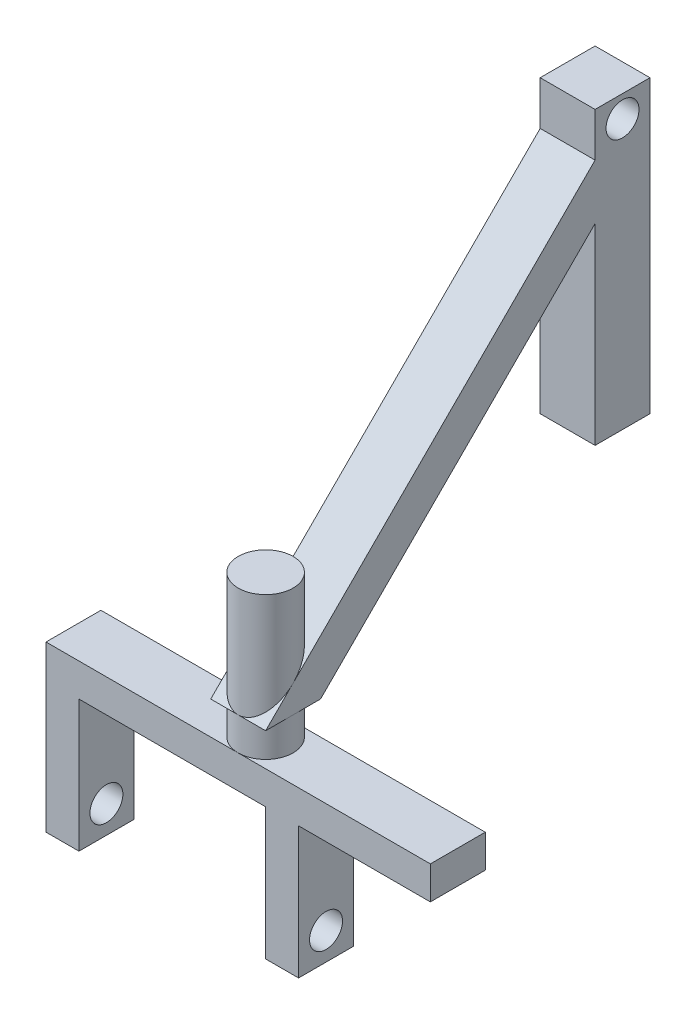
ISO-10303-21;
HEADER;
FILE_DESCRIPTION(('STEP AP214'),'2;1');
FILE_NAME('part.step','',(''),(''),'','','');
FILE_SCHEMA(('AUTOMOTIVE_DESIGN { 1 0 10303 214 1 1 1 1 }'));
ENDSEC;
DATA;
#1=APPLICATION_CONTEXT('core data for automotive mechanical design processes');
#2=APPLICATION_PROTOCOL_DEFINITION('international standard','automotive_design',2000,#1);
#3=PRODUCT_CONTEXT('',#1,'mechanical');
#4=PRODUCT('Part','Part','',(#3));
#5=PRODUCT_RELATED_PRODUCT_CATEGORY('part','',(#4));
#6=PRODUCT_DEFINITION_FORMATION('','',#4);
#7=PRODUCT_DEFINITION_CONTEXT('part definition',#1,'design');
#8=PRODUCT_DEFINITION('design','',#6,#7);
#9=PRODUCT_DEFINITION_SHAPE('','',#8);
#10=(LENGTH_UNIT() NAMED_UNIT(*) SI_UNIT(.MILLI.,.METRE.));
#11=(NAMED_UNIT(*) PLANE_ANGLE_UNIT() SI_UNIT($,.RADIAN.));
#12=(NAMED_UNIT(*) SI_UNIT($,.STERADIAN.) SOLID_ANGLE_UNIT());
#13=UNCERTAINTY_MEASURE_WITH_UNIT(LENGTH_MEASURE(1.E-05),#10,'distance_accuracy_value','');
#14=(GEOMETRIC_REPRESENTATION_CONTEXT(3) GLOBAL_UNCERTAINTY_ASSIGNED_CONTEXT((#13)) GLOBAL_UNIT_ASSIGNED_CONTEXT((#10,
#11,#12)) REPRESENTATION_CONTEXT('',''));
#15=CARTESIAN_POINT('',(0.,0.,0.));
#16=DIRECTION('',(0.,0.,1.));
#17=DIRECTION('',(1.,0.,0.));
#18=AXIS2_PLACEMENT_3D('',#15,#16,#17);
#19=CARTESIAN_POINT('',(0.,0.,50.));
#20=DIRECTION('',(1.,0.,0.));
#21=DIRECTION('',(0.,0.,-1.));
#22=AXIS2_PLACEMENT_3D('',#19,#20,#21);
#23=PLANE('',#22);
#24=CARTESIAN_POINT('',(0.,320.076220664814,25.));
#25=DIRECTION('',(1.,0.,0.));
#26=DIRECTION('',(0.,0.,-1.));
#27=AXIS2_PLACEMENT_3D('',#24,#25,#26);
#28=CIRCLE('',#27,15.);
#29=CARTESIAN_POINT('',(0.,320.076220664814,10.));
#30=VERTEX_POINT('',#29);
#31=EDGE_CURVE('E207',#30,#30,#28,.T.);
#32=ORIENTED_EDGE('',*,*,#31,.T.);
#33=EDGE_LOOP('',(#32));
#34=FACE_BOUND('',#33,.T.);
#35=DIRECTION('',(0.,0.707106781186548,-0.707106781186548));
#36=VECTOR('',#35,1.);
#37=CARTESIAN_POINT('',(0.,0.,350.));
#38=LINE('',#37,#36);
#39=CARTESIAN_POINT('',(0.,25.,325.));
#40=VERTEX_POINT('',#39);
#41=CARTESIAN_POINT('',(0.,300.,50.));
#42=VERTEX_POINT('',#41);
#43=EDGE_CURVE('E211',#40,#42,#38,.T.);
#44=ORIENTED_EDGE('',*,*,#43,.T.);
#45=DIRECTION('',(0.,-1.,0.));
#46=VECTOR('',#45,1.);
#47=CARTESIAN_POINT('',(0.,340.,50.));
#48=LINE('',#47,#46);
#49=CARTESIAN_POINT('',(0.,340.,50.));
#50=VERTEX_POINT('',#49);
#51=EDGE_CURVE('E192',#50,#42,#48,.T.);
#52=ORIENTED_EDGE('',*,*,#51,.F.);
#53=DIRECTION('',(0.,0.,1.));
#54=VECTOR('',#53,1.);
#55=CARTESIAN_POINT('',(0.,340.,0.));
#56=LINE('',#55,#54);
#57=CARTESIAN_POINT('',(0.,340.,0.));
#58=VERTEX_POINT('',#57);
#59=EDGE_CURVE('E199',#58,#50,#56,.T.);
#60=ORIENTED_EDGE('',*,*,#59,.F.);
#61=DIRECTION('',(0.,-1.,0.));
#62=VECTOR('',#61,1.);
#63=CARTESIAN_POINT('',(0.,0.,0.));
#64=LINE('',#63,#62);
#65=CARTESIAN_POINT('',(0.,75.,0.));
#66=VERTEX_POINT('',#65);
#67=EDGE_CURVE('E349',#58,#66,#64,.T.);
#68=ORIENTED_EDGE('',*,*,#67,.T.);
#69=DIRECTION('',(0.,0.,1.));
#70=VECTOR('',#69,1.);
#71=CARTESIAN_POINT('',(0.,75.,0.));
#72=LINE('',#71,#70);
#73=CARTESIAN_POINT('',(0.,75.,50.));
#74=VERTEX_POINT('',#73);
#75=EDGE_CURVE('E340',#66,#74,#72,.T.);
#76=ORIENTED_EDGE('',*,*,#75,.T.);
#77=DIRECTION('',(0.,-1.,0.));
#78=VECTOR('',#77,1.);
#79=CARTESIAN_POINT('',(0.,0.,50.));
#80=LINE('',#79,#78);
#81=CARTESIAN_POINT('',(0.,250.,50.));
#82=VERTEX_POINT('',#81);
#83=EDGE_CURVE('E352',#82,#74,#80,.T.);
#84=ORIENTED_EDGE('',*,*,#83,.F.);
#85=DIRECTION('',(0.,-0.707106781186548,0.707106781186548));
#86=VECTOR('',#85,1.);
#87=CARTESIAN_POINT('',(0.,0.,300.));
#88=LINE('',#87,#86);
#89=CARTESIAN_POINT('',(0.,0.,300.));
#90=VERTEX_POINT('',#89);
#91=EDGE_CURVE('E321',#82,#90,#88,.T.);
#92=ORIENTED_EDGE('',*,*,#91,.T.);
#93=DIRECTION('',(0.,0.,1.));
#94=VECTOR('',#93,1.);
#95=CARTESIAN_POINT('',(0.,0.,350.));
#96=LINE('',#95,#94);
#97=CARTESIAN_POINT('',(0.,0.,325.));
#98=VERTEX_POINT('',#97);
#99=EDGE_CURVE('E325',#90,#98,#96,.T.);
#100=ORIENTED_EDGE('',*,*,#99,.T.);
#101=CARTESIAN_POINT('',(0.,0.,350.));
#102=VERTEX_POINT('',#101);
#103=EDGE_CURVE('E324',#98,#102,#96,.T.);
#104=ORIENTED_EDGE('',*,*,#103,.T.);
#105=EDGE_CURVE('E312',#102,#40,#38,.T.);
#106=ORIENTED_EDGE('',*,*,#105,.T.);
#107=EDGE_LOOP('',(#44,#52,#60,#68,#76,#84,#92,#100,#104,#106));
#108=FACE_BOUND('',#107,.T.);
#109=ADVANCED_FACE('F38',(#34,#108),#23,.F.);
#110=CARTESIAN_POINT('',(50.,0.,50.));
#111=DIRECTION('',(-1.,0.,0.));
#112=DIRECTION('',(0.,0.,1.));
#113=AXIS2_PLACEMENT_3D('',#110,#111,#112);
#114=PLANE('',#113);
#115=CARTESIAN_POINT('',(50.,320.076220664814,25.));
#116=DIRECTION('',(1.,0.,0.));
#117=DIRECTION('',(0.,0.,-1.));
#118=AXIS2_PLACEMENT_3D('',#115,#116,#117);
#119=CIRCLE('',#118,15.);
#120=CARTESIAN_POINT('',(50.,320.076220664814,10.));
#121=VERTEX_POINT('',#120);
#122=EDGE_CURVE('E426',#121,#121,#119,.T.);
#123=ORIENTED_EDGE('',*,*,#122,.F.);
#124=EDGE_LOOP('',(#123));
#125=FACE_BOUND('',#124,.T.);
#126=DIRECTION('',(0.,1.,0.));
#127=VECTOR('',#126,1.);
#128=CARTESIAN_POINT('',(50.,0.,0.));
#129=LINE('',#128,#127);
#130=CARTESIAN_POINT('',(50.,75.,0.));
#131=VERTEX_POINT('',#130);
#132=CARTESIAN_POINT('',(50.,340.,0.));
#133=VERTEX_POINT('',#132);
#134=EDGE_CURVE('E355',#131,#133,#129,.T.);
#135=ORIENTED_EDGE('',*,*,#134,.T.);
#136=DIRECTION('',(0.,0.,-1.));
#137=VECTOR('',#136,1.);
#138=CARTESIAN_POINT('',(50.,340.,0.));
#139=LINE('',#138,#137);
#140=CARTESIAN_POINT('',(50.,340.,50.));
#141=VERTEX_POINT('',#140);
#142=EDGE_CURVE('E198',#141,#133,#139,.T.);
#143=ORIENTED_EDGE('',*,*,#142,.F.);
#144=DIRECTION('',(0.,-1.,0.));
#145=VECTOR('',#144,1.);
#146=CARTESIAN_POINT('',(50.,340.,50.));
#147=LINE('',#146,#145);
#148=CARTESIAN_POINT('',(50.,300.,50.));
#149=VERTEX_POINT('',#148);
#150=EDGE_CURVE('E194',#141,#149,#147,.T.);
#151=ORIENTED_EDGE('',*,*,#150,.T.);
#152=DIRECTION('',(0.,0.707106781186548,-0.707106781186548));
#153=VECTOR('',#152,1.);
#154=CARTESIAN_POINT('',(50.,0.,350.));
#155=LINE('',#154,#153);
#156=CARTESIAN_POINT('',(50.,25.,325.));
#157=VERTEX_POINT('',#156);
#158=EDGE_CURVE('E316',#157,#149,#155,.T.);
#159=ORIENTED_EDGE('',*,*,#158,.F.);
#160=CARTESIAN_POINT('',(50.,0.,350.));
#161=VERTEX_POINT('',#160);
#162=EDGE_CURVE('E317',#161,#157,#155,.T.);
#163=ORIENTED_EDGE('',*,*,#162,.F.);
#164=DIRECTION('',(0.,0.,1.));
#165=VECTOR('',#164,1.);
#166=CARTESIAN_POINT('',(50.,0.,350.));
#167=LINE('',#166,#165);
#168=CARTESIAN_POINT('',(50.,0.,325.));
#169=VERTEX_POINT('',#168);
#170=EDGE_CURVE('E311',#169,#161,#167,.T.);
#171=ORIENTED_EDGE('',*,*,#170,.F.);
#172=CARTESIAN_POINT('',(50.,0.,300.));
#173=VERTEX_POINT('',#172);
#174=EDGE_CURVE('E313',#173,#169,#167,.T.);
#175=ORIENTED_EDGE('',*,*,#174,.F.);
#176=DIRECTION('',(0.,-0.707106781186548,0.707106781186548));
#177=VECTOR('',#176,1.);
#178=CARTESIAN_POINT('',(50.,0.,300.));
#179=LINE('',#178,#177);
#180=CARTESIAN_POINT('',(50.,250.,50.));
#181=VERTEX_POINT('',#180);
#182=EDGE_CURVE('E309',#181,#173,#179,.T.);
#183=ORIENTED_EDGE('',*,*,#182,.F.);
#184=DIRECTION('',(0.,1.,0.));
#185=VECTOR('',#184,1.);
#186=CARTESIAN_POINT('',(50.,0.,50.));
#187=LINE('',#186,#185);
#188=CARTESIAN_POINT('',(50.,75.,50.));
#189=VERTEX_POINT('',#188);
#190=EDGE_CURVE('E354',#189,#181,#187,.T.);
#191=ORIENTED_EDGE('',*,*,#190,.F.);
#192=DIRECTION('',(0.,0.,1.));
#193=VECTOR('',#192,1.);
#194=CARTESIAN_POINT('',(50.,75.,0.));
#195=LINE('',#194,#193);
#196=EDGE_CURVE('E341',#131,#189,#195,.T.);
#197=ORIENTED_EDGE('',*,*,#196,.F.);
#198=EDGE_LOOP('',(#135,#143,#151,#159,#163,#171,#175,#183,#191,#197));
#199=FACE_BOUND('',#198,.T.);
#200=ADVANCED_FACE('F392',(#125,#199),#114,.F.);
#201=CARTESIAN_POINT('',(0.,0.,0.));
#202=DIRECTION('',(0.,0.,-1.));
#203=DIRECTION('',(-1.,0.,0.));
#204=AXIS2_PLACEMENT_3D('',#201,#202,#203);
#205=PLANE('',#204);
#206=ORIENTED_EDGE('',*,*,#67,.F.);
#207=DIRECTION('',(-1.,0.,0.));
#208=VECTOR('',#207,1.);
#209=CARTESIAN_POINT('',(0.,340.,0.));
#210=LINE('',#209,#208);
#211=EDGE_CURVE('E205',#133,#58,#210,.T.);
#212=ORIENTED_EDGE('',*,*,#211,.F.);
#213=ORIENTED_EDGE('',*,*,#134,.F.);
#214=DIRECTION('',(-1.,0.,0.));
#215=VECTOR('',#214,1.);
#216=CARTESIAN_POINT('',(50.,75.,0.));
#217=LINE('',#216,#215);
#218=EDGE_CURVE('E343',#131,#66,#217,.T.);
#219=ORIENTED_EDGE('',*,*,#218,.T.);
#220=EDGE_LOOP('',(#206,#212,#213,#219));
#221=FACE_BOUND('',#220,.T.);
#222=ADVANCED_FACE('F421',(#221),#205,.T.);
#223=CARTESIAN_POINT('',(0.,-60.,0.));
#224=DIRECTION('',(0.,-1.,0.));
#225=DIRECTION('',(0.,0.,-1.));
#226=AXIS2_PLACEMENT_3D('',#223,#224,#225);
#227=PLANE('',#226);
#228=DIRECTION('',(1.,0.,0.));
#229=VECTOR('',#228,1.);
#230=CARTESIAN_POINT('',(50.,-60.,300.));
#231=LINE('',#230,#229);
#232=CARTESIAN_POINT('',(-120.,-60.,300.));
#233=VERTEX_POINT('',#232);
#234=CARTESIAN_POINT('',(50.,-60.,300.));
#235=VERTEX_POINT('',#234);
#236=EDGE_CURVE('E281',#233,#235,#231,.T.);
#237=ORIENTED_EDGE('',*,*,#236,.T.);
#238=DIRECTION('',(0.,0.,-1.));
#239=VECTOR('',#238,1.);
#240=CARTESIAN_POINT('',(50.,-60.,300.));
#241=LINE('',#240,#239);
#242=CARTESIAN_POINT('',(50.,-60.,350.));
#243=VERTEX_POINT('',#242);
#244=EDGE_CURVE('E53',#243,#235,#241,.T.);
#245=ORIENTED_EDGE('',*,*,#244,.F.);
#246=DIRECTION('',(-1.,0.,0.));
#247=VECTOR('',#246,1.);
#248=CARTESIAN_POINT('',(50.,-60.,350.));
#249=LINE('',#248,#247);
#250=CARTESIAN_POINT('',(-120.,-60.,350.));
#251=VERTEX_POINT('',#250);
#252=EDGE_CURVE('E285',#243,#251,#249,.T.);
#253=ORIENTED_EDGE('',*,*,#252,.T.);
#254=DIRECTION('',(0.,0.,-1.));
#255=VECTOR('',#254,1.);
#256=CARTESIAN_POINT('',(-120.,-60.,0.));
#257=LINE('',#256,#255);
#258=EDGE_CURVE('E11',#251,#233,#257,.T.);
#259=ORIENTED_EDGE('',*,*,#258,.T.);
#260=EDGE_LOOP('',(#237,#245,#253,#259));
#261=FACE_BOUND('',#260,.T.);
#262=ADVANCED_FACE('F408',(#261),#227,.T.);
#263=CARTESIAN_POINT('',(200.,-60.,350.));
#264=VERTEX_POINT('',#263);
#265=CARTESIAN_POINT('',(80.,-60.,350.));
#266=VERTEX_POINT('',#265);
#267=EDGE_CURVE('E61',#264,#266,#249,.T.);
#268=ORIENTED_EDGE('',*,*,#267,.T.);
#269=DIRECTION('',(0.,0.,1.));
#270=VECTOR('',#269,1.);
#271=CARTESIAN_POINT('',(80.,-60.,300.));
#272=LINE('',#271,#270);
#273=CARTESIAN_POINT('',(80.,-60.,300.));
#274=VERTEX_POINT('',#273);
#275=EDGE_CURVE('E230',#274,#266,#272,.T.);
#276=ORIENTED_EDGE('',*,*,#275,.F.);
#277=CARTESIAN_POINT('',(200.,-60.,300.));
#278=VERTEX_POINT('',#277);
#279=EDGE_CURVE('E265',#274,#278,#231,.T.);
#280=ORIENTED_EDGE('',*,*,#279,.T.);
#281=DIRECTION('',(0.,0.,1.));
#282=VECTOR('',#281,1.);
#283=CARTESIAN_POINT('',(200.,-60.,350.));
#284=LINE('',#283,#282);
#285=EDGE_CURVE('E283',#278,#264,#284,.T.);
#286=ORIENTED_EDGE('',*,*,#285,.T.);
#287=EDGE_LOOP('',(#268,#276,#280,#286));
#288=FACE_BOUND('',#287,.T.);
#289=ADVANCED_FACE('F401',(#288),#227,.T.);
#290=CARTESIAN_POINT('',(50.,0.,350.));
#291=DIRECTION('',(0.,-1.,0.));
#292=DIRECTION('',(0.,0.,-1.));
#293=AXIS2_PLACEMENT_3D('',#290,#291,#292);
#294=PLANE('',#293);
#295=CARTESIAN_POINT('',(25.,0.,325.));
#296=DIRECTION('',(0.,-1.,0.));
#297=DIRECTION('',(0.,0.,-1.));
#298=AXIS2_PLACEMENT_3D('',#295,#296,#297);
#299=CIRCLE('',#298,25.);
#300=CARTESIAN_POINT('',(25.,0.,300.));
#301=VERTEX_POINT('',#300);
#302=EDGE_CURVE('E290',#301,#169,#299,.T.);
#303=ORIENTED_EDGE('',*,*,#302,.F.);
#304=DIRECTION('',(-1.,0.,0.));
#305=VECTOR('',#304,1.);
#306=CARTESIAN_POINT('',(50.,0.,300.));
#307=LINE('',#306,#305);
#308=EDGE_CURVE('E336',#173,#301,#307,.T.);
#309=ORIENTED_EDGE('',*,*,#308,.F.);
#310=ORIENTED_EDGE('',*,*,#174,.T.);
#311=EDGE_LOOP('',(#303,#309,#310));
#312=FACE_BOUND('',#311,.T.);
#313=ADVANCED_FACE('F398',(#312),#294,.T.);
#314=CARTESIAN_POINT('',(25.,0.,350.));
#315=VERTEX_POINT('',#314);
#316=EDGE_CURVE('E300',#169,#315,#299,.T.);
#317=ORIENTED_EDGE('',*,*,#316,.F.);
#318=ORIENTED_EDGE('',*,*,#170,.T.);
#319=DIRECTION('',(-1.,0.,0.));
#320=VECTOR('',#319,1.);
#321=CARTESIAN_POINT('',(50.,0.,350.));
#322=LINE('',#321,#320);
#323=EDGE_CURVE('E332',#161,#315,#322,.T.);
#324=ORIENTED_EDGE('',*,*,#323,.T.);
#325=EDGE_LOOP('',(#317,#318,#324));
#326=FACE_BOUND('',#325,.T.);
#327=ADVANCED_FACE('F400',(#326),#294,.T.);
#328=EDGE_CURVE('E366',#315,#98,#299,.T.);
#329=ORIENTED_EDGE('',*,*,#328,.F.);
#330=EDGE_CURVE('E335',#315,#102,#322,.T.);
#331=ORIENTED_EDGE('',*,*,#330,.T.);
#332=ORIENTED_EDGE('',*,*,#103,.F.);
#333=EDGE_LOOP('',(#329,#331,#332));
#334=FACE_BOUND('',#333,.T.);
#335=ADVANCED_FACE('F379',(#334),#294,.T.);
#336=CARTESIAN_POINT('',(50.,0.,350.));
#337=DIRECTION('',(0.,0.707106781186548,0.707106781186548));
#338=DIRECTION('',(0.,-0.707106781186548,0.707106781186548));
#339=AXIS2_PLACEMENT_3D('',#336,#337,#338);
#340=PLANE('',#339);
#341=CARTESIAN_POINT('',(25.,25.,325.));
#342=DIRECTION('',(0.,0.707106781186548,0.707106781186548));
#343=DIRECTION('',(0.,-0.707106781186548,0.707106781186548));
#344=AXIS2_PLACEMENT_3D('',#341,#342,#343);
#345=ELLIPSE('',#344,35.3553390593274,25.);
#346=EDGE_CURVE('E308',#315,#157,#345,.T.);
#347=ORIENTED_EDGE('',*,*,#346,.F.);
#348=ORIENTED_EDGE('',*,*,#323,.F.);
#349=ORIENTED_EDGE('',*,*,#162,.T.);
#350=EDGE_LOOP('',(#347,#348,#349));
#351=FACE_BOUND('',#350,.T.);
#352=ADVANCED_FACE('F466',(#351),#340,.T.);
#353=EDGE_CURVE('E307',#157,#40,#345,.T.);
#354=ORIENTED_EDGE('',*,*,#353,.F.);
#355=ORIENTED_EDGE('',*,*,#158,.T.);
#356=DIRECTION('',(-1.,0.,0.));
#357=VECTOR('',#356,1.);
#358=CARTESIAN_POINT('',(50.,300.,50.));
#359=LINE('',#358,#357);
#360=EDGE_CURVE('E329',#149,#42,#359,.T.);
#361=ORIENTED_EDGE('',*,*,#360,.T.);
#362=ORIENTED_EDGE('',*,*,#43,.F.);
#363=EDGE_LOOP('',(#354,#355,#361,#362));
#364=FACE_BOUND('',#363,.T.);
#365=ADVANCED_FACE('F441',(#364),#340,.T.);
#366=CARTESIAN_POINT('',(0.,0.,50.));
#367=DIRECTION('',(0.,0.,-1.));
#368=DIRECTION('',(-1.,0.,0.));
#369=AXIS2_PLACEMENT_3D('',#366,#367,#368);
#370=PLANE('',#369);
#371=ORIENTED_EDGE('',*,*,#190,.T.);
#372=DIRECTION('',(-1.,0.,0.));
#373=VECTOR('',#372,1.);
#374=CARTESIAN_POINT('',(0.,250.,50.));
#375=LINE('',#374,#373);
#376=EDGE_CURVE('E331',#181,#82,#375,.T.);
#377=ORIENTED_EDGE('',*,*,#376,.T.);
#378=ORIENTED_EDGE('',*,*,#83,.T.);
#379=DIRECTION('',(-1.,0.,0.));
#380=VECTOR('',#379,1.);
#381=CARTESIAN_POINT('',(50.,75.,50.));
#382=LINE('',#381,#380);
#383=EDGE_CURVE('E346',#189,#74,#382,.T.);
#384=ORIENTED_EDGE('',*,*,#383,.F.);
#385=EDGE_LOOP('',(#371,#377,#378,#384));
#386=FACE_BOUND('',#385,.T.);
#387=ADVANCED_FACE('F387',(#386),#370,.F.);
#388=CARTESIAN_POINT('',(50.,75.,0.));
#389=DIRECTION('',(0.,-1.,0.));
#390=DIRECTION('',(0.,0.,-1.));
#391=AXIS2_PLACEMENT_3D('',#388,#389,#390);
#392=PLANE('',#391);
#393=ORIENTED_EDGE('',*,*,#75,.F.);
#394=ORIENTED_EDGE('',*,*,#218,.F.);
#395=ORIENTED_EDGE('',*,*,#196,.T.);
#396=ORIENTED_EDGE('',*,*,#383,.T.);
#397=EDGE_LOOP('',(#393,#394,#395,#396));
#398=FACE_BOUND('',#397,.T.);
#399=ADVANCED_FACE('F434',(#398),#392,.T.);
#400=CARTESIAN_POINT('',(50.,0.,300.));
#401=DIRECTION('',(0.,-0.707106781186548,-0.707106781186548));
#402=DIRECTION('',(0.,0.707106781186548,-0.707106781186548));
#403=AXIS2_PLACEMENT_3D('',#400,#401,#402);
#404=PLANE('',#403);
#405=ORIENTED_EDGE('',*,*,#376,.F.);
#406=ORIENTED_EDGE('',*,*,#182,.T.);
#407=ORIENTED_EDGE('',*,*,#308,.T.);
#408=EDGE_CURVE('E320',#301,#90,#307,.T.);
#409=ORIENTED_EDGE('',*,*,#408,.T.);
#410=ORIENTED_EDGE('',*,*,#91,.F.);
#411=EDGE_LOOP('',(#405,#406,#407,#409,#410));
#412=FACE_BOUND('',#411,.T.);
#413=ADVANCED_FACE('F384',(#412),#404,.T.);
#414=EDGE_CURVE('E304',#40,#315,#345,.T.);
#415=ORIENTED_EDGE('',*,*,#414,.F.);
#416=ORIENTED_EDGE('',*,*,#105,.F.);
#417=ORIENTED_EDGE('',*,*,#330,.F.);
#418=EDGE_LOOP('',(#415,#416,#417));
#419=FACE_BOUND('',#418,.T.);
#420=ADVANCED_FACE('F414',(#419),#340,.T.);
#421=EDGE_CURVE('E301',#98,#301,#299,.T.);
#422=ORIENTED_EDGE('',*,*,#421,.F.);
#423=ORIENTED_EDGE('',*,*,#99,.F.);
#424=ORIENTED_EDGE('',*,*,#408,.F.);
#425=EDGE_LOOP('',(#422,#423,#424));
#426=FACE_BOUND('',#425,.T.);
#427=ADVANCED_FACE('F376',(#426),#294,.T.);
#428=CARTESIAN_POINT('',(25.,100.,325.));
#429=DIRECTION('',(0.,-1.,0.));
#430=DIRECTION('',(0.,0.,-1.));
#431=AXIS2_PLACEMENT_3D('',#428,#429,#430);
#432=CYLINDRICAL_SURFACE('',#431,25.);
#433=CARTESIAN_POINT('',(25.,100.,325.));
#434=DIRECTION('',(0.,-1.,0.));
#435=DIRECTION('',(0.,0.,-1.));
#436=AXIS2_PLACEMENT_3D('',#433,#434,#435);
#437=CIRCLE('',#436,25.);
#438=CARTESIAN_POINT('',(25.,100.,300.));
#439=VERTEX_POINT('',#438);
#440=EDGE_CURVE('E299',#439,#439,#437,.T.);
#441=ORIENTED_EDGE('',*,*,#440,.T.);
#442=EDGE_LOOP('',(#441));
#443=FACE_BOUND('',#442,.T.);
#444=ORIENTED_EDGE('',*,*,#414,.T.);
#445=ORIENTED_EDGE('',*,*,#346,.T.);
#446=ORIENTED_EDGE('',*,*,#353,.T.);
#447=EDGE_LOOP('',(#444,#445,#446));
#448=FACE_BOUND('',#447,.T.);
#449=ADVANCED_FACE('F413',(#443,#448),#432,.T.);
#450=CARTESIAN_POINT('',(0.,100.,0.));
#451=DIRECTION('',(0.,-1.,0.));
#452=DIRECTION('',(0.,0.,-1.));
#453=AXIS2_PLACEMENT_3D('',#450,#451,#452);
#454=PLANE('',#453);
#455=ORIENTED_EDGE('',*,*,#440,.F.);
#456=EDGE_LOOP('',(#455));
#457=FACE_BOUND('',#456,.T.);
#458=ADVANCED_FACE('F458',(#457),#454,.F.);
#459=CARTESIAN_POINT('',(25.,-60.,325.));
#460=DIRECTION('',(0.,1.,0.));
#461=DIRECTION('',(0.,0.,1.));
#462=AXIS2_PLACEMENT_3D('',#459,#460,#461);
#463=CYLINDRICAL_SURFACE('',#462,25.);
#464=CARTESIAN_POINT('',(25.,-30.,325.));
#465=DIRECTION('',(0.,1.,0.));
#466=DIRECTION('',(0.,0.,1.));
#467=AXIS2_PLACEMENT_3D('',#464,#465,#466);
#468=CIRCLE('',#467,25.);
#469=CARTESIAN_POINT('',(25.,-30.,300.));
#470=VERTEX_POINT('',#469);
#471=CARTESIAN_POINT('',(25.,-30.,350.));
#472=VERTEX_POINT('',#471);
#473=EDGE_CURVE('E360',#470,#472,#468,.T.);
#474=ORIENTED_EDGE('',*,*,#473,.T.);
#475=EDGE_CURVE('E46',#472,#470,#468,.T.);
#476=ORIENTED_EDGE('',*,*,#475,.T.);
#477=EDGE_LOOP('',(#474,#476));
#478=FACE_BOUND('',#477,.T.);
#479=ORIENTED_EDGE('',*,*,#302,.T.);
#480=ORIENTED_EDGE('',*,*,#316,.T.);
#481=ORIENTED_EDGE('',*,*,#328,.T.);
#482=ORIENTED_EDGE('',*,*,#421,.T.);
#483=EDGE_LOOP('',(#479,#480,#481,#482));
#484=FACE_BOUND('',#483,.T.);
#485=ADVANCED_FACE('F370',(#478,#484),#463,.T.);
#486=CARTESIAN_POINT('',(0.,-30.,0.));
#487=DIRECTION('',(0.,1.,0.));
#488=DIRECTION('',(0.,0.,1.));
#489=AXIS2_PLACEMENT_3D('',#486,#487,#488);
#490=PLANE('',#489);
#491=ORIENTED_EDGE('',*,*,#475,.F.);
#492=DIRECTION('',(-1.,0.,0.));
#493=VECTOR('',#492,1.);
#494=CARTESIAN_POINT('',(0.,-30.,350.));
#495=LINE('',#494,#493);
#496=CARTESIAN_POINT('',(200.,-30.,350.));
#497=VERTEX_POINT('',#496);
#498=EDGE_CURVE('E268',#497,#472,#495,.T.);
#499=ORIENTED_EDGE('',*,*,#498,.F.);
#500=DIRECTION('',(0.,0.,1.));
#501=VECTOR('',#500,1.);
#502=CARTESIAN_POINT('',(200.,-30.,350.));
#503=LINE('',#502,#501);
#504=CARTESIAN_POINT('',(200.,-30.,300.));
#505=VERTEX_POINT('',#504);
#506=EDGE_CURVE('E277',#505,#497,#503,.T.);
#507=ORIENTED_EDGE('',*,*,#506,.F.);
#508=DIRECTION('',(1.,0.,0.));
#509=VECTOR('',#508,1.);
#510=CARTESIAN_POINT('',(0.,-30.,300.));
#511=LINE('',#510,#509);
#512=EDGE_CURVE('E274',#470,#505,#511,.T.);
#513=ORIENTED_EDGE('',*,*,#512,.F.);
#514=EDGE_LOOP('',(#491,#499,#507,#513));
#515=FACE_BOUND('',#514,.T.);
#516=ADVANCED_FACE('F457',(#515),#490,.T.);
#517=CARTESIAN_POINT('',(50.,-30.,350.));
#518=DIRECTION('',(0.,0.,1.));
#519=DIRECTION('',(1.,0.,0.));
#520=AXIS2_PLACEMENT_3D('',#517,#518,#519);
#521=PLANE('',#520);
#522=DIRECTION('',(0.,1.,0.));
#523=VECTOR('',#522,1.);
#524=CARTESIAN_POINT('',(-120.,-30.,350.));
#525=LINE('',#524,#523);
#526=CARTESIAN_POINT('',(-120.,-180.,350.));
#527=VERTEX_POINT('',#526);
#528=EDGE_CURVE('E256',#527,#251,#525,.T.);
#529=ORIENTED_EDGE('',*,*,#528,.T.);
#530=ORIENTED_EDGE('',*,*,#252,.F.);
#531=DIRECTION('',(0.,1.,0.));
#532=VECTOR('',#531,1.);
#533=CARTESIAN_POINT('',(50.,-180.,350.));
#534=LINE('',#533,#532);
#535=CARTESIAN_POINT('',(50.,-180.,350.));
#536=VERTEX_POINT('',#535);
#537=EDGE_CURVE('E236',#536,#243,#534,.T.);
#538=ORIENTED_EDGE('',*,*,#537,.F.);
#539=DIRECTION('',(-1.,0.,0.));
#540=VECTOR('',#539,1.);
#541=CARTESIAN_POINT('',(50.,-180.,350.));
#542=LINE('',#541,#540);
#543=CARTESIAN_POINT('',(80.,-180.,350.));
#544=VERTEX_POINT('',#543);
#545=EDGE_CURVE('E234',#544,#536,#542,.T.);
#546=ORIENTED_EDGE('',*,*,#545,.F.);
#547=DIRECTION('',(0.,1.,0.));
#548=VECTOR('',#547,1.);
#549=CARTESIAN_POINT('',(80.,-180.,350.));
#550=LINE('',#549,#548);
#551=EDGE_CURVE('E241',#544,#266,#550,.T.);
#552=ORIENTED_EDGE('',*,*,#551,.T.);
#553=ORIENTED_EDGE('',*,*,#267,.F.);
#554=DIRECTION('',(0.,-1.,0.));
#555=VECTOR('',#554,1.);
#556=CARTESIAN_POINT('',(200.,-30.,350.));
#557=LINE('',#556,#555);
#558=EDGE_CURVE('E287',#497,#264,#557,.T.);
#559=ORIENTED_EDGE('',*,*,#558,.F.);
#560=ORIENTED_EDGE('',*,*,#498,.T.);
#561=CARTESIAN_POINT('',(-150.,-30.,350.));
#562=VERTEX_POINT('',#561);
#563=EDGE_CURVE('E271',#472,#562,#495,.T.);
#564=ORIENTED_EDGE('',*,*,#563,.T.);
#565=DIRECTION('',(0.,-1.,0.));
#566=VECTOR('',#565,1.);
#567=CARTESIAN_POINT('',(-150.,-30.,350.));
#568=LINE('',#567,#566);
#569=CARTESIAN_POINT('',(-150.,-180.,350.));
#570=VERTEX_POINT('',#569);
#571=EDGE_CURVE('E280',#562,#570,#568,.T.);
#572=ORIENTED_EDGE('',*,*,#571,.T.);
#573=DIRECTION('',(-1.,0.,0.));
#574=VECTOR('',#573,1.);
#575=CARTESIAN_POINT('',(-120.,-180.,350.));
#576=LINE('',#575,#574);
#577=EDGE_CURVE('E262',#527,#570,#576,.T.);
#578=ORIENTED_EDGE('',*,*,#577,.F.);
#579=EDGE_LOOP('',(#529,#530,#538,#546,#552,#553,#559,#560,#564,#572,#578));
#580=FACE_BOUND('',#579,.T.);
#581=ADVANCED_FACE('F566',(#580),#521,.T.);
#582=CARTESIAN_POINT('',(50.,-30.,300.));
#583=DIRECTION('',(0.,0.,-1.));
#584=DIRECTION('',(-1.,0.,0.));
#585=AXIS2_PLACEMENT_3D('',#582,#583,#584);
#586=PLANE('',#585);
#587=CARTESIAN_POINT('',(-150.,-30.,300.));
#588=VERTEX_POINT('',#587);
#589=EDGE_CURVE('E275',#588,#470,#511,.T.);
#590=ORIENTED_EDGE('',*,*,#589,.T.);
#591=ORIENTED_EDGE('',*,*,#512,.T.);
#592=DIRECTION('',(0.,-1.,0.));
#593=VECTOR('',#592,1.);
#594=CARTESIAN_POINT('',(200.,-30.,300.));
#595=LINE('',#594,#593);
#596=EDGE_CURVE('E291',#505,#278,#595,.T.);
#597=ORIENTED_EDGE('',*,*,#596,.T.);
#598=ORIENTED_EDGE('',*,*,#279,.F.);
#599=DIRECTION('',(0.,1.,0.));
#600=VECTOR('',#599,1.);
#601=CARTESIAN_POINT('',(80.,-180.,300.));
#602=LINE('',#601,#600);
#603=CARTESIAN_POINT('',(80.,-180.,300.));
#604=VERTEX_POINT('',#603);
#605=EDGE_CURVE('E244',#604,#274,#602,.T.);
#606=ORIENTED_EDGE('',*,*,#605,.F.);
#607=DIRECTION('',(1.,0.,0.));
#608=VECTOR('',#607,1.);
#609=CARTESIAN_POINT('',(50.,-180.,300.));
#610=LINE('',#609,#608);
#611=CARTESIAN_POINT('',(50.,-180.,300.));
#612=VERTEX_POINT('',#611);
#613=EDGE_CURVE('E229',#612,#604,#610,.T.);
#614=ORIENTED_EDGE('',*,*,#613,.F.);
#615=DIRECTION('',(0.,1.,0.));
#616=VECTOR('',#615,1.);
#617=CARTESIAN_POINT('',(50.,-180.,300.));
#618=LINE('',#617,#616);
#619=EDGE_CURVE('E247',#612,#235,#618,.T.);
#620=ORIENTED_EDGE('',*,*,#619,.T.);
#621=ORIENTED_EDGE('',*,*,#236,.F.);
#622=DIRECTION('',(0.,-1.,0.));
#623=VECTOR('',#622,1.);
#624=CARTESIAN_POINT('',(-120.,-30.,300.));
#625=LINE('',#624,#623);
#626=CARTESIAN_POINT('',(-120.,-180.,300.));
#627=VERTEX_POINT('',#626);
#628=EDGE_CURVE('E251',#233,#627,#625,.T.);
#629=ORIENTED_EDGE('',*,*,#628,.T.);
#630=DIRECTION('',(-1.,0.,0.));
#631=VECTOR('',#630,1.);
#632=CARTESIAN_POINT('',(-120.,-180.,300.));
#633=LINE('',#632,#631);
#634=CARTESIAN_POINT('',(-150.,-180.,300.));
#635=VERTEX_POINT('',#634);
#636=EDGE_CURVE('E259',#627,#635,#633,.T.);
#637=ORIENTED_EDGE('',*,*,#636,.T.);
#638=DIRECTION('',(0.,-1.,0.));
#639=VECTOR('',#638,1.);
#640=CARTESIAN_POINT('',(-150.,-30.,300.));
#641=LINE('',#640,#639);
#642=EDGE_CURVE('E294',#588,#635,#641,.T.);
#643=ORIENTED_EDGE('',*,*,#642,.F.);
#644=EDGE_LOOP('',(#590,#591,#597,#598,#606,#614,#620,#621,#629,#637,#643));
#645=FACE_BOUND('',#644,.T.);
#646=ADVANCED_FACE('F581',(#645),#586,.T.);
#647=CARTESIAN_POINT('',(200.,-30.,350.));
#648=DIRECTION('',(1.,0.,0.));
#649=DIRECTION('',(0.,0.,-1.));
#650=AXIS2_PLACEMENT_3D('',#647,#648,#649);
#651=PLANE('',#650);
#652=ORIENTED_EDGE('',*,*,#285,.F.);
#653=ORIENTED_EDGE('',*,*,#596,.F.);
#654=ORIENTED_EDGE('',*,*,#506,.T.);
#655=ORIENTED_EDGE('',*,*,#558,.T.);
#656=EDGE_LOOP('',(#652,#653,#654,#655));
#657=FACE_BOUND('',#656,.T.);
#658=ADVANCED_FACE('F576',(#657),#651,.T.);
#659=CARTESIAN_POINT('',(-150.,-30.,300.));
#660=DIRECTION('',(-1.,0.,0.));
#661=DIRECTION('',(0.,0.,1.));
#662=AXIS2_PLACEMENT_3D('',#659,#660,#661);
#663=PLANE('',#662);
#664=CARTESIAN_POINT('',(-150.,-155.,325.));
#665=DIRECTION('',(-1.,0.,0.));
#666=DIRECTION('',(0.,0.,1.));
#667=AXIS2_PLACEMENT_3D('',#664,#665,#666);
#668=CIRCLE('',#667,15.);
#669=CARTESIAN_POINT('',(-150.,-155.,340.));
#670=VERTEX_POINT('',#669);
#671=EDGE_CURVE('E213',#670,#670,#668,.T.);
#672=ORIENTED_EDGE('',*,*,#671,.F.);
#673=EDGE_LOOP('',(#672));
#674=FACE_BOUND('',#673,.T.);
#675=ORIENTED_EDGE('',*,*,#642,.T.);
#676=DIRECTION('',(0.,0.,1.));
#677=VECTOR('',#676,1.);
#678=CARTESIAN_POINT('',(-150.,-180.,300.));
#679=LINE('',#678,#677);
#680=EDGE_CURVE('E250',#635,#570,#679,.T.);
#681=ORIENTED_EDGE('',*,*,#680,.T.);
#682=ORIENTED_EDGE('',*,*,#571,.F.);
#683=DIRECTION('',(0.,0.,-1.));
#684=VECTOR('',#683,1.);
#685=CARTESIAN_POINT('',(-150.,-30.,300.));
#686=LINE('',#685,#684);
#687=EDGE_CURVE('E270',#562,#588,#686,.T.);
#688=ORIENTED_EDGE('',*,*,#687,.T.);
#689=EDGE_LOOP('',(#675,#681,#682,#688));
#690=FACE_BOUND('',#689,.T.);
#691=ADVANCED_FACE('F453',(#674,#690),#663,.T.);
#692=ORIENTED_EDGE('',*,*,#687,.F.);
#693=ORIENTED_EDGE('',*,*,#563,.F.);
#694=ORIENTED_EDGE('',*,*,#473,.F.);
#695=ORIENTED_EDGE('',*,*,#589,.F.);
#696=EDGE_LOOP('',(#692,#693,#694,#695));
#697=FACE_BOUND('',#696,.T.);
#698=ADVANCED_FACE('F569',(#697),#490,.T.);
#699=CARTESIAN_POINT('',(-120.,-180.,300.));
#700=DIRECTION('',(0.,-1.,0.));
#701=DIRECTION('',(0.,0.,-1.));
#702=AXIS2_PLACEMENT_3D('',#699,#700,#701);
#703=PLANE('',#702);
#704=ORIENTED_EDGE('',*,*,#680,.F.);
#705=ORIENTED_EDGE('',*,*,#636,.F.);
#706=DIRECTION('',(0.,0.,1.));
#707=VECTOR('',#706,1.);
#708=CARTESIAN_POINT('',(-120.,-180.,300.));
#709=LINE('',#708,#707);
#710=EDGE_CURVE('E253',#627,#527,#709,.T.);
#711=ORIENTED_EDGE('',*,*,#710,.T.);
#712=ORIENTED_EDGE('',*,*,#577,.T.);
#713=EDGE_LOOP('',(#704,#705,#711,#712));
#714=FACE_BOUND('',#713,.T.);
#715=ADVANCED_FACE('F596',(#714),#703,.T.);
#716=CARTESIAN_POINT('',(-120.,0.,0.));
#717=DIRECTION('',(-1.,0.,0.));
#718=DIRECTION('',(0.,0.,1.));
#719=AXIS2_PLACEMENT_3D('',#716,#717,#718);
#720=PLANE('',#719);
#721=CARTESIAN_POINT('',(-120.,-155.,325.));
#722=DIRECTION('',(-1.,0.,0.));
#723=DIRECTION('',(0.,0.,1.));
#724=AXIS2_PLACEMENT_3D('',#721,#722,#723);
#725=CIRCLE('',#724,15.);
#726=CARTESIAN_POINT('',(-120.,-155.,340.));
#727=VERTEX_POINT('',#726);
#728=EDGE_CURVE('E223',#727,#727,#725,.T.);
#729=ORIENTED_EDGE('',*,*,#728,.T.);
#730=EDGE_LOOP('',(#729));
#731=FACE_BOUND('',#730,.T.);
#732=ORIENTED_EDGE('',*,*,#258,.F.);
#733=ORIENTED_EDGE('',*,*,#528,.F.);
#734=ORIENTED_EDGE('',*,*,#710,.F.);
#735=ORIENTED_EDGE('',*,*,#628,.F.);
#736=EDGE_LOOP('',(#732,#733,#734,#735));
#737=FACE_BOUND('',#736,.T.);
#738=ADVANCED_FACE('F606',(#731,#737),#720,.F.);
#739=CARTESIAN_POINT('',(50.,-180.,300.));
#740=DIRECTION('',(1.,0.,0.));
#741=DIRECTION('',(0.,0.,-1.));
#742=AXIS2_PLACEMENT_3D('',#739,#740,#741);
#743=PLANE('',#742);
#744=CARTESIAN_POINT('',(50.,-155.,325.));
#745=DIRECTION('',(1.,0.,0.));
#746=DIRECTION('',(0.,0.,-1.));
#747=AXIS2_PLACEMENT_3D('',#744,#745,#746);
#748=CIRCLE('',#747,15.);
#749=CARTESIAN_POINT('',(50.,-155.,310.));
#750=VERTEX_POINT('',#749);
#751=EDGE_CURVE('E220',#750,#750,#748,.T.);
#752=ORIENTED_EDGE('',*,*,#751,.T.);
#753=EDGE_LOOP('',(#752));
#754=FACE_BOUND('',#753,.T.);
#755=ORIENTED_EDGE('',*,*,#244,.T.);
#756=ORIENTED_EDGE('',*,*,#619,.F.);
#757=DIRECTION('',(0.,0.,-1.));
#758=VECTOR('',#757,1.);
#759=CARTESIAN_POINT('',(50.,-180.,300.));
#760=LINE('',#759,#758);
#761=EDGE_CURVE('E226',#536,#612,#760,.T.);
#762=ORIENTED_EDGE('',*,*,#761,.F.);
#763=ORIENTED_EDGE('',*,*,#537,.T.);
#764=EDGE_LOOP('',(#755,#756,#762,#763));
#765=FACE_BOUND('',#764,.T.);
#766=ADVANCED_FACE('F672',(#754,#765),#743,.F.);
#767=CARTESIAN_POINT('',(80.,-180.,300.));
#768=DIRECTION('',(-1.,0.,0.));
#769=DIRECTION('',(0.,0.,1.));
#770=AXIS2_PLACEMENT_3D('',#767,#768,#769);
#771=PLANE('',#770);
#772=CARTESIAN_POINT('',(80.,-155.,325.));
#773=DIRECTION('',(-1.,0.,0.));
#774=DIRECTION('',(0.,0.,1.));
#775=AXIS2_PLACEMENT_3D('',#772,#773,#774);
#776=CIRCLE('',#775,15.);
#777=CARTESIAN_POINT('',(80.,-155.,340.));
#778=VERTEX_POINT('',#777);
#779=EDGE_CURVE('E41',#778,#778,#776,.T.);
#780=ORIENTED_EDGE('',*,*,#779,.T.);
#781=EDGE_LOOP('',(#780));
#782=FACE_BOUND('',#781,.T.);
#783=ORIENTED_EDGE('',*,*,#275,.T.);
#784=ORIENTED_EDGE('',*,*,#551,.F.);
#785=DIRECTION('',(0.,0.,1.));
#786=VECTOR('',#785,1.);
#787=CARTESIAN_POINT('',(80.,-180.,300.));
#788=LINE('',#787,#786);
#789=EDGE_CURVE('E232',#604,#544,#788,.T.);
#790=ORIENTED_EDGE('',*,*,#789,.F.);
#791=ORIENTED_EDGE('',*,*,#605,.T.);
#792=EDGE_LOOP('',(#783,#784,#790,#791));
#793=FACE_BOUND('',#792,.T.);
#794=ADVANCED_FACE('F653',(#782,#793),#771,.F.);
#795=CARTESIAN_POINT('',(0.,-180.,0.));
#796=DIRECTION('',(0.,1.,0.));
#797=DIRECTION('',(0.,0.,1.));
#798=AXIS2_PLACEMENT_3D('',#795,#796,#797);
#799=PLANE('',#798);
#800=ORIENTED_EDGE('',*,*,#761,.T.);
#801=ORIENTED_EDGE('',*,*,#613,.T.);
#802=ORIENTED_EDGE('',*,*,#789,.T.);
#803=ORIENTED_EDGE('',*,*,#545,.T.);
#804=EDGE_LOOP('',(#800,#801,#802,#803));
#805=FACE_BOUND('',#804,.T.);
#806=ADVANCED_FACE('F647',(#805),#799,.F.);
#807=CARTESIAN_POINT('',(140.,-155.,325.));
#808=DIRECTION('',(-1.,0.,0.));
#809=DIRECTION('',(0.,0.,1.));
#810=AXIS2_PLACEMENT_3D('',#807,#808,#809);
#811=CYLINDRICAL_SURFACE('',#810,15.);
#812=ORIENTED_EDGE('',*,*,#779,.F.);
#813=EDGE_LOOP('',(#812));
#814=FACE_BOUND('',#813,.T.);
#815=ORIENTED_EDGE('',*,*,#751,.F.);
#816=EDGE_LOOP('',(#815));
#817=FACE_BOUND('',#816,.T.);
#818=ADVANCED_FACE('F652',(#814,#817),#811,.F.);
#819=ORIENTED_EDGE('',*,*,#671,.T.);
#820=EDGE_LOOP('',(#819));
#821=FACE_BOUND('',#820,.T.);
#822=ORIENTED_EDGE('',*,*,#728,.F.);
#823=EDGE_LOOP('',(#822));
#824=FACE_BOUND('',#823,.T.);
#825=ADVANCED_FACE('F699',(#821,#824),#811,.F.);
#826=CARTESIAN_POINT('',(0.,340.,50.));
#827=DIRECTION('',(0.,0.,-1.));
#828=DIRECTION('',(-1.,0.,0.));
#829=AXIS2_PLACEMENT_3D('',#826,#827,#828);
#830=PLANE('',#829);
#831=ORIENTED_EDGE('',*,*,#360,.F.);
#832=ORIENTED_EDGE('',*,*,#150,.F.);
#833=DIRECTION('',(1.,0.,0.));
#834=VECTOR('',#833,1.);
#835=CARTESIAN_POINT('',(0.,340.,50.));
#836=LINE('',#835,#834);
#837=EDGE_CURVE('E187',#50,#141,#836,.T.);
#838=ORIENTED_EDGE('',*,*,#837,.F.);
#839=ORIENTED_EDGE('',*,*,#51,.T.);
#840=EDGE_LOOP('',(#831,#832,#838,#839));
#841=FACE_BOUND('',#840,.T.);
#842=ADVANCED_FACE('F190',(#841),#830,.F.);
#843=CARTESIAN_POINT('',(0.,340.,0.));
#844=DIRECTION('',(0.,1.,0.));
#845=DIRECTION('',(0.,0.,1.));
#846=AXIS2_PLACEMENT_3D('',#843,#844,#845);
#847=PLANE('',#846);
#848=ORIENTED_EDGE('',*,*,#59,.T.);
#849=ORIENTED_EDGE('',*,*,#837,.T.);
#850=ORIENTED_EDGE('',*,*,#142,.T.);
#851=ORIENTED_EDGE('',*,*,#211,.T.);
#852=EDGE_LOOP('',(#848,#849,#850,#851));
#853=FACE_BOUND('',#852,.T.);
#854=ADVANCED_FACE('F203',(#853),#847,.T.);
#855=CARTESIAN_POINT('',(-40.,320.076220664814,25.));
#856=DIRECTION('',(1.,0.,0.));
#857=DIRECTION('',(0.,0.,-1.));
#858=AXIS2_PLACEMENT_3D('',#855,#856,#857);
#859=CYLINDRICAL_SURFACE('',#858,15.);
#860=CARTESIAN_POINT('',(50.,320.076220664814,10.));
#861=CARTESIAN_POINT('',(49.4791666666667,320.076220664814,10.));
#862=CARTESIAN_POINT('',(48.9583333333333,320.076220664814,10.));
#863=CARTESIAN_POINT('',(47.9166666666667,320.076220664814,10.));
#864=CARTESIAN_POINT('',(47.3958333333333,320.076220664814,10.));
#865=CARTESIAN_POINT('',(46.3541666666667,320.076220664814,10.));
#866=CARTESIAN_POINT('',(45.8333333333333,320.076220664814,10.));
#867=CARTESIAN_POINT('',(44.7916666666667,320.076220664814,10.));
#868=CARTESIAN_POINT('',(44.2708333333333,320.076220664814,10.));
#869=CARTESIAN_POINT('',(43.2291666666667,320.076220664814,10.));
#870=CARTESIAN_POINT('',(42.7083333333333,320.076220664814,10.));
#871=CARTESIAN_POINT('',(41.6666666666667,320.076220664814,10.));
#872=CARTESIAN_POINT('',(41.1458333333333,320.076220664814,10.));
#873=CARTESIAN_POINT('',(40.1041666666667,320.076220664814,10.));
#874=CARTESIAN_POINT('',(39.5833333333333,320.076220664814,10.));
#875=CARTESIAN_POINT('',(38.5416666666667,320.076220664814,10.));
#876=CARTESIAN_POINT('',(38.0208333333333,320.076220664814,10.));
#877=CARTESIAN_POINT('',(36.9791666666667,320.076220664814,10.));
#878=CARTESIAN_POINT('',(36.4583333333333,320.076220664814,10.));
#879=CARTESIAN_POINT('',(35.4166666666667,320.076220664814,10.));
#880=CARTESIAN_POINT('',(34.8958333333333,320.076220664814,10.));
#881=CARTESIAN_POINT('',(33.8541666666667,320.076220664814,10.));
#882=CARTESIAN_POINT('',(33.3333333333333,320.076220664814,10.));
#883=CARTESIAN_POINT('',(32.2916666666667,320.076220664814,10.));
#884=CARTESIAN_POINT('',(31.7708333333333,320.076220664814,10.));
#885=CARTESIAN_POINT('',(30.7291666666667,320.076220664814,10.));
#886=CARTESIAN_POINT('',(30.2083333333333,320.076220664814,10.));
#887=CARTESIAN_POINT('',(29.1666666666667,320.076220664814,10.));
#888=CARTESIAN_POINT('',(28.6458333333333,320.076220664814,10.));
#889=CARTESIAN_POINT('',(27.6041666666667,320.076220664814,10.));
#890=CARTESIAN_POINT('',(27.0833333333333,320.076220664814,10.));
#891=CARTESIAN_POINT('',(26.0416666666667,320.076220664814,10.));
#892=CARTESIAN_POINT('',(25.5208333333333,320.076220664814,10.));
#893=CARTESIAN_POINT('',(24.4791666666667,320.076220664814,10.));
#894=CARTESIAN_POINT('',(23.9583333333333,320.076220664814,10.));
#895=CARTESIAN_POINT('',(22.9166666666667,320.076220664814,10.));
#896=CARTESIAN_POINT('',(22.3958333333333,320.076220664814,10.));
#897=CARTESIAN_POINT('',(21.3541666666667,320.076220664814,10.));
#898=CARTESIAN_POINT('',(20.8333333333333,320.076220664814,10.));
#899=CARTESIAN_POINT('',(19.7916666666667,320.076220664814,10.));
#900=CARTESIAN_POINT('',(19.2708333333333,320.076220664814,10.));
#901=CARTESIAN_POINT('',(18.2291666666667,320.076220664814,10.));
#902=CARTESIAN_POINT('',(17.7083333333333,320.076220664814,10.));
#903=CARTESIAN_POINT('',(16.6666666666667,320.076220664814,10.));
#904=CARTESIAN_POINT('',(16.1458333333333,320.076220664814,10.));
#905=CARTESIAN_POINT('',(15.1041666666667,320.076220664814,10.));
#906=CARTESIAN_POINT('',(14.5833333333333,320.076220664814,10.));
#907=CARTESIAN_POINT('',(13.5416666666667,320.076220664814,10.));
#908=CARTESIAN_POINT('',(13.0208333333333,320.076220664814,10.));
#909=CARTESIAN_POINT('',(11.9791666666667,320.076220664814,10.));
#910=CARTESIAN_POINT('',(11.4583333333333,320.076220664814,10.));
#911=CARTESIAN_POINT('',(10.4166666666667,320.076220664814,10.));
#912=CARTESIAN_POINT('',(9.89583333333333,320.076220664814,10.));
#913=CARTESIAN_POINT('',(8.85416666666666,320.076220664814,10.));
#914=CARTESIAN_POINT('',(8.33333333333333,320.076220664814,10.));
#915=CARTESIAN_POINT('',(7.29166666666666,320.076220664814,10.));
#916=CARTESIAN_POINT('',(6.77083333333333,320.076220664814,10.));
#917=CARTESIAN_POINT('',(5.72916666666666,320.076220664814,10.));
#918=CARTESIAN_POINT('',(5.20833333333332,320.076220664814,10.));
#919=CARTESIAN_POINT('',(4.16666666666666,320.076220664814,10.));
#920=CARTESIAN_POINT('',(3.64583333333333,320.076220664814,10.));
#921=CARTESIAN_POINT('',(2.60416666666666,320.076220664814,10.));
#922=CARTESIAN_POINT('',(2.08333333333333,320.076220664814,10.));
#923=CARTESIAN_POINT('',(1.04166666666666,320.076220664814,10.));
#924=CARTESIAN_POINT('',(0.520833333333327,320.076220664814,10.));
#925=CARTESIAN_POINT('',(0.,320.076220664814,10.));
#926=B_SPLINE_CURVE_WITH_KNOTS('',3,(#860,#861,#862,#863,#864,#865,#866,#867,#868,#869,#870,
#871,#872,#873,#874,#875,#876,#877,#878,#879,#880,#881,#882,#883,#884,#885,#886,#887,#888,#889,
#890,#891,#892,#893,#894,#895,#896,#897,#898,#899,#900,#901,#902,#903,#904,#905,#906,#907,#908,
#909,#910,#911,#912,#913,#914,#915,#916,#917,#918,#919,#920,#921,#922,#923,#924,#925),
.UNSPECIFIED.,.F.,.F.,(4,2,2,2,2,2,2,2,2,2,2,2,2,2,2,2,2,2,2,2,2,2,2,2,2,2,2,2,2,2,2,2,4),(0.,
1.56249999999999,3.125,4.6875,6.25000000000001,7.8125,9.37499999999999,10.9375,12.5,14.0625,
15.625,17.1875,18.75,20.3125,21.875,23.4375,25.,26.5625,28.125,29.6875,31.25,32.8125,34.375,
35.9375,37.5,39.0625,40.625,42.1875,43.75,45.3125,46.875,48.4375,50.),.UNSPECIFIED.);
#927=EDGE_CURVE('BSEAM742',#121,#30,#926,.T.);
#928=ORIENTED_EDGE('',*,*,#122,.T.);
#929=ORIENTED_EDGE('',*,*,#31,.F.);
#930=ORIENTED_EDGE('',*,*,#927,.T.);
#931=ORIENTED_EDGE('',*,*,#927,.F.);
#932=EDGE_LOOP('',(#928,#930,#929,#931));
#933=FACE_BOUND('',#932,.T.);
#934=ADVANCED_FACE('F742',(#933),#859,.F.);
#935=CLOSED_SHELL('',(#109,#200,#222,#262,#289,#313,#327,#335,#352,#365,#387,#399,#413,#420,
#427,#449,#458,#485,#516,#581,#646,#658,#691,#698,#715,#738,#766,#794,#806,#818,#825,#842,#854,#934));
#936=MANIFOLD_SOLID_BREP('B2',#935);
#937=ADVANCED_BREP_SHAPE_REPRESENTATION('',(#18,#936),#14);
#938=SHAPE_DEFINITION_REPRESENTATION(#9,#937);
ENDSEC;
END-ISO-10303-21;
